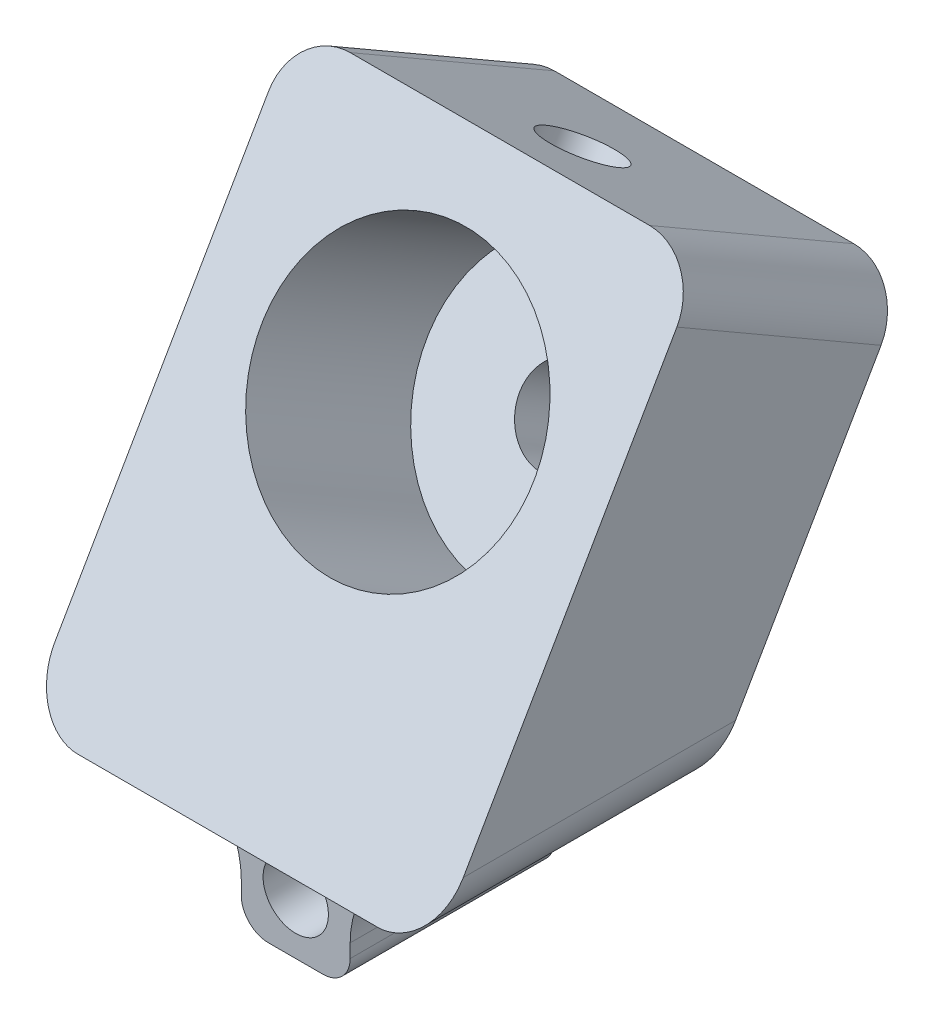
ISO-10303-21;
HEADER;
FILE_DESCRIPTION(('STEP AP214'),'2;1');
FILE_NAME('part.step','',(''),(''),'','','');
FILE_SCHEMA(('AUTOMOTIVE_DESIGN { 1 0 10303 214 1 1 1 1 }'));
ENDSEC;
DATA;
#1=APPLICATION_CONTEXT('core data for automotive mechanical design processes');
#2=APPLICATION_PROTOCOL_DEFINITION('international standard','automotive_design',2000,#1);
#3=PRODUCT_CONTEXT('',#1,'mechanical');
#4=PRODUCT('Part','Part','',(#3));
#5=PRODUCT_RELATED_PRODUCT_CATEGORY('part','',(#4));
#6=PRODUCT_DEFINITION_FORMATION('','',#4);
#7=PRODUCT_DEFINITION_CONTEXT('part definition',#1,'design');
#8=PRODUCT_DEFINITION('design','',#6,#7);
#9=PRODUCT_DEFINITION_SHAPE('','',#8);
#10=(LENGTH_UNIT() NAMED_UNIT(*) SI_UNIT(.MILLI.,.METRE.));
#11=(NAMED_UNIT(*) PLANE_ANGLE_UNIT() SI_UNIT($,.RADIAN.));
#12=(NAMED_UNIT(*) SI_UNIT($,.STERADIAN.) SOLID_ANGLE_UNIT());
#13=UNCERTAINTY_MEASURE_WITH_UNIT(LENGTH_MEASURE(1.E-05),#10,'distance_accuracy_value','');
#14=(GEOMETRIC_REPRESENTATION_CONTEXT(3) GLOBAL_UNCERTAINTY_ASSIGNED_CONTEXT((#13)) GLOBAL_UNIT_ASSIGNED_CONTEXT((#10,
#11,#12)) REPRESENTATION_CONTEXT('',''));
#15=CARTESIAN_POINT('',(0.,0.,0.));
#16=DIRECTION('',(0.,0.,1.));
#17=DIRECTION('',(1.,0.,0.));
#18=AXIS2_PLACEMENT_3D('',#15,#16,#17);
#19=CARTESIAN_POINT('',(2.,-2.5,3.75));
#20=DIRECTION('',(-1.,0.,0.));
#21=DIRECTION('',(0.,0.,1.));
#22=AXIS2_PLACEMENT_3D('',#19,#20,#21);
#23=PLANE('',#22);
#24=DIRECTION('',(0.,1.,0.));
#25=VECTOR('',#24,1.);
#26=CARTESIAN_POINT('',(2.,-2.5,3.75));
#27=LINE('',#26,#25);
#28=CARTESIAN_POINT('',(2.,-1.5,3.75));
#29=VERTEX_POINT('',#28);
#30=CARTESIAN_POINT('',(2.,-1.,3.75));
#31=VERTEX_POINT('',#30);
#32=EDGE_CURVE('E239',#29,#31,#27,.T.);
#33=ORIENTED_EDGE('',*,*,#32,.F.);
#34=DIRECTION('',(0.,0.,-1.));
#35=VECTOR('',#34,1.);
#36=CARTESIAN_POINT('',(2.,-1.5,3.75));
#37=LINE('',#36,#35);
#38=CARTESIAN_POINT('',(2.,-1.5,-3.75));
#39=VERTEX_POINT('',#38);
#40=EDGE_CURVE('E349',#29,#39,#37,.T.);
#41=ORIENTED_EDGE('',*,*,#40,.T.);
#42=DIRECTION('',(0.,1.,0.));
#43=VECTOR('',#42,1.);
#44=CARTESIAN_POINT('',(2.,-2.5,-3.75));
#45=LINE('',#44,#43);
#46=CARTESIAN_POINT('',(2.,-1.,-3.75));
#47=VERTEX_POINT('',#46);
#48=EDGE_CURVE('E233',#39,#47,#45,.T.);
#49=ORIENTED_EDGE('',*,*,#48,.T.);
#50=DIRECTION('',(0.,0.,-1.));
#51=VECTOR('',#50,1.);
#52=CARTESIAN_POINT('',(2.,-1.,3.75));
#53=LINE('',#52,#51);
#54=EDGE_CURVE('E275',#47,#31,#53,.F.);
#55=ORIENTED_EDGE('',*,*,#54,.T.);
#56=EDGE_LOOP('',(#33,#41,#49,#55));
#57=FACE_BOUND('',#56,.T.);
#58=ADVANCED_FACE('F39',(#57),#23,.F.);
#59=CARTESIAN_POINT('',(-2.,-2.5,3.75));
#60=DIRECTION('',(1.,0.,0.));
#61=DIRECTION('',(0.,0.,-1.));
#62=AXIS2_PLACEMENT_3D('',#59,#60,#61);
#63=PLANE('',#62);
#64=DIRECTION('',(0.,-1.,0.));
#65=VECTOR('',#64,1.);
#66=CARTESIAN_POINT('',(-2.,-2.5,-3.75));
#67=LINE('',#66,#65);
#68=CARTESIAN_POINT('',(-2.,-1.,-3.75));
#69=VERTEX_POINT('',#68);
#70=CARTESIAN_POINT('',(-2.,-1.5,-3.75));
#71=VERTEX_POINT('',#70);
#72=EDGE_CURVE('E256',#69,#71,#67,.T.);
#73=ORIENTED_EDGE('',*,*,#72,.T.);
#74=DIRECTION('',(0.,0.,-1.));
#75=VECTOR('',#74,1.);
#76=CARTESIAN_POINT('',(-2.,-1.5,3.75));
#77=LINE('',#76,#75);
#78=CARTESIAN_POINT('',(-2.,-1.5,3.75));
#79=VERTEX_POINT('',#78);
#80=EDGE_CURVE('E372',#71,#79,#77,.F.);
#81=ORIENTED_EDGE('',*,*,#80,.T.);
#82=DIRECTION('',(0.,-1.,0.));
#83=VECTOR('',#82,1.);
#84=CARTESIAN_POINT('',(-2.,-2.5,3.75));
#85=LINE('',#84,#83);
#86=CARTESIAN_POINT('',(-2.,-1.,3.75));
#87=VERTEX_POINT('',#86);
#88=EDGE_CURVE('E242',#87,#79,#85,.T.);
#89=ORIENTED_EDGE('',*,*,#88,.F.);
#90=DIRECTION('',(0.,0.,-1.));
#91=VECTOR('',#90,1.);
#92=CARTESIAN_POINT('',(-2.,-1.,-3.75));
#93=LINE('',#92,#91);
#94=EDGE_CURVE('E279',#87,#69,#93,.T.);
#95=ORIENTED_EDGE('',*,*,#94,.T.);
#96=EDGE_LOOP('',(#73,#81,#89,#95));
#97=FACE_BOUND('',#96,.T.);
#98=ADVANCED_FACE('F438',(#97),#63,.F.);
#99=CARTESIAN_POINT('',(-2.,-2.5,3.75));
#100=DIRECTION('',(0.,1.,0.));
#101=DIRECTION('',(0.,0.,1.));
#102=AXIS2_PLACEMENT_3D('',#99,#100,#101);
#103=PLANE('',#102);
#104=DIRECTION('',(1.,0.,0.));
#105=VECTOR('',#104,1.);
#106=CARTESIAN_POINT('',(-2.,-2.5,-3.75));
#107=LINE('',#106,#105);
#108=CARTESIAN_POINT('',(-1.,-2.5,-3.75));
#109=VERTEX_POINT('',#108);
#110=CARTESIAN_POINT('',(1.,-2.5,-3.75));
#111=VERTEX_POINT('',#110);
#112=EDGE_CURVE('E243',#109,#111,#107,.T.);
#113=ORIENTED_EDGE('',*,*,#112,.T.);
#114=DIRECTION('',(0.,0.,-1.));
#115=VECTOR('',#114,1.);
#116=CARTESIAN_POINT('',(1.,-2.5,3.75));
#117=LINE('',#116,#115);
#118=CARTESIAN_POINT('',(1.,-2.5,3.75));
#119=VERTEX_POINT('',#118);
#120=EDGE_CURVE('E363',#111,#119,#117,.F.);
#121=ORIENTED_EDGE('',*,*,#120,.T.);
#122=DIRECTION('',(1.,0.,0.));
#123=VECTOR('',#122,1.);
#124=CARTESIAN_POINT('',(-2.,-2.5,3.75));
#125=LINE('',#124,#123);
#126=CARTESIAN_POINT('',(-1.,-2.5,3.75));
#127=VERTEX_POINT('',#126);
#128=EDGE_CURVE('E247',#127,#119,#125,.T.);
#129=ORIENTED_EDGE('',*,*,#128,.F.);
#130=DIRECTION('',(0.,0.,-1.));
#131=VECTOR('',#130,1.);
#132=CARTESIAN_POINT('',(-1.,-2.5,3.75));
#133=LINE('',#132,#131);
#134=EDGE_CURVE('E359',#127,#109,#133,.T.);
#135=ORIENTED_EDGE('',*,*,#134,.T.);
#136=EDGE_LOOP('',(#113,#121,#129,#135));
#137=FACE_BOUND('',#136,.T.);
#138=ADVANCED_FACE('F443',(#137),#103,.F.);
#139=CARTESIAN_POINT('',(0.,0.,3.75));
#140=DIRECTION('',(0.,0.,-1.));
#141=DIRECTION('',(-1.,0.,0.));
#142=AXIS2_PLACEMENT_3D('',#139,#140,#141);
#143=PLANE('',#142);
#144=CARTESIAN_POINT('',(0.,-0.5,3.75));
#145=DIRECTION('',(0.,0.,1.));
#146=DIRECTION('',(1.,0.,0.));
#147=AXIS2_PLACEMENT_3D('',#144,#145,#146);
#148=CIRCLE('',#147,1.2);
#149=CARTESIAN_POINT('',(1.2,-0.5,3.75));
#150=VERTEX_POINT('',#149);
#151=EDGE_CURVE('E268',#150,#150,#148,.T.);
#152=ORIENTED_EDGE('',*,*,#151,.F.);
#153=EDGE_LOOP('',(#152));
#154=FACE_BOUND('',#153,.T.);
#155=CARTESIAN_POINT('',(5.5,-1.,3.75));
#156=DIRECTION('',(0.,0.,-1.));
#157=DIRECTION('',(-1.,0.,0.));
#158=AXIS2_PLACEMENT_3D('',#155,#156,#157);
#159=CIRCLE('',#158,3.5);
#160=CARTESIAN_POINT('',(3.05051025721682,1.5,3.75));
#161=VERTEX_POINT('',#160);
#162=EDGE_CURVE('E287',#31,#161,#159,.T.);
#163=ORIENTED_EDGE('',*,*,#162,.T.);
#164=DIRECTION('',(-1.,0.,0.));
#165=VECTOR('',#164,1.);
#166=CARTESIAN_POINT('',(-5.5,1.5,3.75));
#167=LINE('',#166,#165);
#168=CARTESIAN_POINT('',(-3.05051025721682,1.5,3.75));
#169=VERTEX_POINT('',#168);
#170=EDGE_CURVE('E375',#161,#169,#167,.T.);
#171=ORIENTED_EDGE('',*,*,#170,.T.);
#172=CARTESIAN_POINT('',(-5.5,-1.,3.75));
#173=DIRECTION('',(0.,0.,-1.));
#174=DIRECTION('',(-1.,0.,0.));
#175=AXIS2_PLACEMENT_3D('',#172,#173,#174);
#176=CIRCLE('',#175,3.5);
#177=EDGE_CURVE('E295',#169,#87,#176,.T.);
#178=ORIENTED_EDGE('',*,*,#177,.T.);
#179=ORIENTED_EDGE('',*,*,#88,.T.);
#180=CARTESIAN_POINT('',(-1.,-1.5,3.75));
#181=DIRECTION('',(0.,0.,-1.));
#182=DIRECTION('',(-1.,0.,0.));
#183=AXIS2_PLACEMENT_3D('',#180,#181,#182);
#184=CIRCLE('',#183,1.);
#185=EDGE_CURVE('E366',#79,#127,#184,.F.);
#186=ORIENTED_EDGE('',*,*,#185,.T.);
#187=ORIENTED_EDGE('',*,*,#128,.T.);
#188=CARTESIAN_POINT('',(1.,-1.5,3.75));
#189=DIRECTION('',(0.,0.,-1.));
#190=DIRECTION('',(-1.,0.,0.));
#191=AXIS2_PLACEMENT_3D('',#188,#189,#190);
#192=CIRCLE('',#191,1.);
#193=EDGE_CURVE('E369',#119,#29,#192,.F.);
#194=ORIENTED_EDGE('',*,*,#193,.T.);
#195=ORIENTED_EDGE('',*,*,#32,.T.);
#196=EDGE_LOOP('',(#163,#171,#178,#179,#186,#187,#194,#195));
#197=FACE_BOUND('',#196,.T.);
#198=ADVANCED_FACE('F450',(#154,#197),#143,.F.);
#199=CARTESIAN_POINT('',(0.,0.,-3.75));
#200=DIRECTION('',(0.,0.,-1.));
#201=DIRECTION('',(-1.,0.,0.));
#202=AXIS2_PLACEMENT_3D('',#199,#200,#201);
#203=PLANE('',#202);
#204=DIRECTION('',(0.,1.,0.));
#205=VECTOR('',#204,1.);
#206=CARTESIAN_POINT('',(-1.55,-2.1,-3.75));
#207=LINE('',#206,#205);
#208=CARTESIAN_POINT('',(-1.55,-2.1,-3.75));
#209=VERTEX_POINT('',#208);
#210=CARTESIAN_POINT('',(-1.55,1.,-3.75));
#211=VERTEX_POINT('',#210);
#212=EDGE_CURVE('E188',#209,#211,#207,.T.);
#213=ORIENTED_EDGE('',*,*,#212,.F.);
#214=DIRECTION('',(-1.,0.,0.));
#215=VECTOR('',#214,1.);
#216=CARTESIAN_POINT('',(1.55,-2.1,-3.75));
#217=LINE('',#216,#215);
#218=CARTESIAN_POINT('',(1.55,-2.1,-3.75));
#219=VERTEX_POINT('',#218);
#220=EDGE_CURVE('E208',#219,#209,#217,.T.);
#221=ORIENTED_EDGE('',*,*,#220,.F.);
#222=DIRECTION('',(0.,-1.,0.));
#223=VECTOR('',#222,1.);
#224=CARTESIAN_POINT('',(1.55,-2.1,-3.75));
#225=LINE('',#224,#223);
#226=CARTESIAN_POINT('',(1.55,1.,-3.75));
#227=VERTEX_POINT('',#226);
#228=EDGE_CURVE('E212',#227,#219,#225,.T.);
#229=ORIENTED_EDGE('',*,*,#228,.F.);
#230=DIRECTION('',(1.,0.,0.));
#231=VECTOR('',#230,1.);
#232=CARTESIAN_POINT('',(1.55,1.,-3.75));
#233=LINE('',#232,#231);
#234=EDGE_CURVE('E224',#211,#227,#233,.T.);
#235=ORIENTED_EDGE('',*,*,#234,.F.);
#236=EDGE_LOOP('',(#213,#221,#229,#235));
#237=FACE_BOUND('',#236,.T.);
#238=ORIENTED_EDGE('',*,*,#48,.F.);
#239=CARTESIAN_POINT('',(1.,-1.5,-3.75));
#240=DIRECTION('',(0.,0.,-1.));
#241=DIRECTION('',(-1.,0.,0.));
#242=AXIS2_PLACEMENT_3D('',#239,#240,#241);
#243=CIRCLE('',#242,1.);
#244=EDGE_CURVE('E356',#39,#111,#243,.T.);
#245=ORIENTED_EDGE('',*,*,#244,.T.);
#246=ORIENTED_EDGE('',*,*,#112,.F.);
#247=CARTESIAN_POINT('',(-1.,-1.5,-3.75));
#248=DIRECTION('',(0.,0.,-1.));
#249=DIRECTION('',(-1.,0.,0.));
#250=AXIS2_PLACEMENT_3D('',#247,#248,#249);
#251=CIRCLE('',#250,1.);
#252=EDGE_CURVE('E353',#109,#71,#251,.T.);
#253=ORIENTED_EDGE('',*,*,#252,.T.);
#254=ORIENTED_EDGE('',*,*,#72,.F.);
#255=CARTESIAN_POINT('',(-5.5,-1.,-3.75));
#256=DIRECTION('',(0.,0.,-1.));
#257=DIRECTION('',(-1.,0.,0.));
#258=AXIS2_PLACEMENT_3D('',#255,#256,#257);
#259=CIRCLE('',#258,3.5);
#260=CARTESIAN_POINT('',(-5.5,2.5,-3.75));
#261=VERTEX_POINT('',#260);
#262=EDGE_CURVE('E291',#69,#261,#259,.F.);
#263=ORIENTED_EDGE('',*,*,#262,.T.);
#264=DIRECTION('',(-1.,0.,0.));
#265=VECTOR('',#264,1.);
#266=CARTESIAN_POINT('',(-2.,2.5,-3.75));
#267=LINE('',#266,#265);
#268=CARTESIAN_POINT('',(5.5,2.5,-3.75));
#269=VERTEX_POINT('',#268);
#270=EDGE_CURVE('E253',#269,#261,#267,.T.);
#271=ORIENTED_EDGE('',*,*,#270,.F.);
#272=CARTESIAN_POINT('',(5.5,-1.,-3.75));
#273=DIRECTION('',(0.,0.,-1.));
#274=DIRECTION('',(-1.,0.,0.));
#275=AXIS2_PLACEMENT_3D('',#272,#273,#274);
#276=CIRCLE('',#275,3.5);
#277=EDGE_CURVE('E283',#269,#47,#276,.F.);
#278=ORIENTED_EDGE('',*,*,#277,.T.);
#279=EDGE_LOOP('',(#238,#245,#246,#253,#254,#263,#271,#278));
#280=FACE_BOUND('',#279,.T.);
#281=ADVANCED_FACE('F452',(#237,#280),#203,.T.);
#282=CARTESIAN_POINT('',(-1.55,-2.1,1.25));
#283=DIRECTION('',(-1.,0.,0.));
#284=DIRECTION('',(0.,0.,1.));
#285=AXIS2_PLACEMENT_3D('',#282,#283,#284);
#286=PLANE('',#285);
#287=ORIENTED_EDGE('',*,*,#212,.T.);
#288=DIRECTION('',(0.,0.,-1.));
#289=VECTOR('',#288,1.);
#290=CARTESIAN_POINT('',(-1.55,1.,1.25));
#291=LINE('',#290,#289);
#292=CARTESIAN_POINT('',(-1.55,1.,1.25));
#293=VERTEX_POINT('',#292);
#294=EDGE_CURVE('E181',#293,#211,#291,.T.);
#295=ORIENTED_EDGE('',*,*,#294,.F.);
#296=DIRECTION('',(0.,1.,0.));
#297=VECTOR('',#296,1.);
#298=CARTESIAN_POINT('',(-1.55,-2.1,1.25));
#299=LINE('',#298,#297);
#300=CARTESIAN_POINT('',(-1.55,-2.1,1.25));
#301=VERTEX_POINT('',#300);
#302=EDGE_CURVE('E185',#301,#293,#299,.T.);
#303=ORIENTED_EDGE('',*,*,#302,.F.);
#304=DIRECTION('',(0.,0.,-1.));
#305=VECTOR('',#304,1.);
#306=CARTESIAN_POINT('',(-1.55,-2.1,1.25));
#307=LINE('',#306,#305);
#308=EDGE_CURVE('E230',#301,#209,#307,.T.);
#309=ORIENTED_EDGE('',*,*,#308,.T.);
#310=EDGE_LOOP('',(#287,#295,#303,#309));
#311=FACE_BOUND('',#310,.T.);
#312=ADVANCED_FACE('F183',(#311),#286,.F.);
#313=CARTESIAN_POINT('',(1.55,-2.1,1.25));
#314=DIRECTION('',(0.,-1.,0.));
#315=DIRECTION('',(0.,0.,-1.));
#316=AXIS2_PLACEMENT_3D('',#313,#314,#315);
#317=PLANE('',#316);
#318=ORIENTED_EDGE('',*,*,#220,.T.);
#319=ORIENTED_EDGE('',*,*,#308,.F.);
#320=DIRECTION('',(-1.,0.,0.));
#321=VECTOR('',#320,1.);
#322=CARTESIAN_POINT('',(1.55,-2.1,1.25));
#323=LINE('',#322,#321);
#324=CARTESIAN_POINT('',(1.55,-2.1,1.25));
#325=VERTEX_POINT('',#324);
#326=EDGE_CURVE('E194',#325,#301,#323,.T.);
#327=ORIENTED_EDGE('',*,*,#326,.F.);
#328=DIRECTION('',(0.,0.,-1.));
#329=VECTOR('',#328,1.);
#330=CARTESIAN_POINT('',(1.55,-2.1,1.25));
#331=LINE('',#330,#329);
#332=EDGE_CURVE('E234',#325,#219,#331,.T.);
#333=ORIENTED_EDGE('',*,*,#332,.T.);
#334=EDGE_LOOP('',(#318,#319,#327,#333));
#335=FACE_BOUND('',#334,.T.);
#336=ADVANCED_FACE('F461',(#335),#317,.F.);
#337=CARTESIAN_POINT('',(1.55,-2.1,1.25));
#338=DIRECTION('',(1.,0.,0.));
#339=DIRECTION('',(0.,0.,-1.));
#340=AXIS2_PLACEMENT_3D('',#337,#338,#339);
#341=PLANE('',#340);
#342=ORIENTED_EDGE('',*,*,#228,.T.);
#343=ORIENTED_EDGE('',*,*,#332,.F.);
#344=DIRECTION('',(0.,-1.,0.));
#345=VECTOR('',#344,1.);
#346=CARTESIAN_POINT('',(1.55,-2.1,1.25));
#347=LINE('',#346,#345);
#348=CARTESIAN_POINT('',(1.55,1.,1.25));
#349=VERTEX_POINT('',#348);
#350=EDGE_CURVE('E203',#349,#325,#347,.T.);
#351=ORIENTED_EDGE('',*,*,#350,.F.);
#352=DIRECTION('',(0.,0.,-1.));
#353=VECTOR('',#352,1.);
#354=CARTESIAN_POINT('',(1.55,1.,1.25));
#355=LINE('',#354,#353);
#356=EDGE_CURVE('E193',#349,#227,#355,.T.);
#357=ORIENTED_EDGE('',*,*,#356,.T.);
#358=EDGE_LOOP('',(#342,#343,#351,#357));
#359=FACE_BOUND('',#358,.T.);
#360=ADVANCED_FACE('F464',(#359),#341,.F.);
#361=CARTESIAN_POINT('',(1.55,1.,1.25));
#362=DIRECTION('',(0.,1.,0.));
#363=DIRECTION('',(0.,0.,1.));
#364=AXIS2_PLACEMENT_3D('',#361,#362,#363);
#365=PLANE('',#364);
#366=ORIENTED_EDGE('',*,*,#234,.T.);
#367=ORIENTED_EDGE('',*,*,#356,.F.);
#368=DIRECTION('',(1.,0.,0.));
#369=VECTOR('',#368,1.);
#370=CARTESIAN_POINT('',(1.55,1.,1.25));
#371=LINE('',#370,#369);
#372=EDGE_CURVE('E197',#293,#349,#371,.T.);
#373=ORIENTED_EDGE('',*,*,#372,.F.);
#374=ORIENTED_EDGE('',*,*,#294,.T.);
#375=EDGE_LOOP('',(#366,#367,#373,#374));
#376=FACE_BOUND('',#375,.T.);
#377=ADVANCED_FACE('F198',(#376),#365,.F.);
#378=CARTESIAN_POINT('',(0.,0.,1.25));
#379=DIRECTION('',(0.,0.,1.));
#380=DIRECTION('',(1.,0.,0.));
#381=AXIS2_PLACEMENT_3D('',#378,#379,#380);
#382=PLANE('',#381);
#383=CARTESIAN_POINT('',(0.,-0.5,1.25));
#384=DIRECTION('',(0.,0.,1.));
#385=DIRECTION('',(1.,0.,0.));
#386=AXIS2_PLACEMENT_3D('',#383,#384,#385);
#387=CIRCLE('',#386,1.2);
#388=CARTESIAN_POINT('',(1.2,-0.5,1.25));
#389=VERTEX_POINT('',#388);
#390=EDGE_CURVE('E263',#389,#389,#387,.T.);
#391=ORIENTED_EDGE('',*,*,#390,.T.);
#392=EDGE_LOOP('',(#391));
#393=FACE_BOUND('',#392,.T.);
#394=ORIENTED_EDGE('',*,*,#302,.T.);
#395=ORIENTED_EDGE('',*,*,#372,.T.);
#396=ORIENTED_EDGE('',*,*,#350,.T.);
#397=ORIENTED_EDGE('',*,*,#326,.T.);
#398=EDGE_LOOP('',(#394,#395,#396,#397));
#399=FACE_BOUND('',#398,.T.);
#400=ADVANCED_FACE('F205',(#393,#399),#382,.F.);
#401=CARTESIAN_POINT('',(7.5,2.5,-3.75));
#402=DIRECTION('',(0.,1.,0.));
#403=DIRECTION('',(0.,0.,1.));
#404=AXIS2_PLACEMENT_3D('',#401,#402,#403);
#405=PLANE('',#404);
#406=DIRECTION('',(0.,0.,-1.));
#407=VECTOR('',#406,1.);
#408=CARTESIAN_POINT('',(-5.5,2.5,-3.75));
#409=LINE('',#408,#407);
#410=CARTESIAN_POINT('',(-5.5,2.5,6.25));
#411=VERTEX_POINT('',#410);
#412=CARTESIAN_POINT('',(-5.5,2.5,4.75));
#413=VERTEX_POINT('',#412);
#414=EDGE_CURVE('E343',#411,#413,#409,.T.);
#415=ORIENTED_EDGE('',*,*,#414,.T.);
#416=DIRECTION('',(-1.,0.,0.));
#417=VECTOR('',#416,1.);
#418=CARTESIAN_POINT('',(5.5,2.5,4.75));
#419=LINE('',#418,#417);
#420=CARTESIAN_POINT('',(5.5,2.5,4.75));
#421=VERTEX_POINT('',#420);
#422=EDGE_CURVE('E385',#413,#421,#419,.F.);
#423=ORIENTED_EDGE('',*,*,#422,.T.);
#424=DIRECTION('',(0.,0.,-1.));
#425=VECTOR('',#424,1.);
#426=CARTESIAN_POINT('',(5.5,2.5,-3.75));
#427=LINE('',#426,#425);
#428=CARTESIAN_POINT('',(5.5,2.5,6.25));
#429=VERTEX_POINT('',#428);
#430=EDGE_CURVE('E346',#421,#429,#427,.F.);
#431=ORIENTED_EDGE('',*,*,#430,.T.);
#432=DIRECTION('',(-1.,0.,0.));
#433=VECTOR('',#432,1.);
#434=CARTESIAN_POINT('',(7.5,2.5,6.25));
#435=LINE('',#434,#433);
#436=EDGE_CURVE('E549',#429,#411,#435,.T.);
#437=ORIENTED_EDGE('',*,*,#436,.T.);
#438=EDGE_LOOP('',(#415,#423,#431,#437));
#439=FACE_BOUND('',#438,.T.);
#440=ADVANCED_FACE('F473',(#439),#405,.F.);
#441=CARTESIAN_POINT('',(7.5,15.4903810567665,-11.2500000000001));
#442=DIRECTION('',(0.,0.500000000000004,0.866025403784436));
#443=DIRECTION('',(0.,-0.866025403784436,0.500000000000004));
#444=AXIS2_PLACEMENT_3D('',#441,#442,#443);
#445=PLANE('',#444);
#446=CARTESIAN_POINT('',(0.,8.99519052838327,-7.50000000000003));
#447=DIRECTION('',(0.,-0.500000000000004,-0.866025403784437));
#448=DIRECTION('',(0.,0.866025403784437,-0.500000000000004));
#449=AXIS2_PLACEMENT_3D('',#446,#447,#448);
#450=CIRCLE('',#449,1.5875);
#451=CARTESIAN_POINT('',(0.,10.3700058568911,-8.29375000000003));
#452=VERTEX_POINT('',#451);
#453=EDGE_CURVE('E381',#452,#452,#450,.T.);
#454=ORIENTED_EDGE('',*,*,#453,.F.);
#455=EDGE_LOOP('',(#454));
#456=FACE_BOUND('',#455,.T.);
#457=DIRECTION('',(0.,0.866025403784436,-0.500000000000004));
#458=VECTOR('',#457,1.);
#459=CARTESIAN_POINT('',(-7.5,15.4903810567665,-11.2500000000001));
#460=LINE('',#459,#458);
#461=CARTESIAN_POINT('',(-7.5,4.5,-4.90470053837926));
#462=VERTEX_POINT('',#461);
#463=CARTESIAN_POINT('',(-7.5,13.7583302491977,-10.2500000000001));
#464=VERTEX_POINT('',#463);
#465=EDGE_CURVE('E267',#462,#464,#460,.T.);
#466=ORIENTED_EDGE('',*,*,#465,.T.);
#467=CARTESIAN_POINT('',(-5.5,13.7583302491977,-10.2500000000001));
#468=DIRECTION('',(0.,0.500000000000004,0.866025403784436));
#469=DIRECTION('',(0.,-0.866025403784436,0.500000000000004));
#470=AXIS2_PLACEMENT_3D('',#467,#468,#469);
#471=CIRCLE('',#470,2.);
#472=CARTESIAN_POINT('',(-5.5,15.4903810567665,-11.2500000000001));
#473=VERTEX_POINT('',#472);
#474=EDGE_CURVE('E332',#464,#473,#471,.F.);
#475=ORIENTED_EDGE('',*,*,#474,.T.);
#476=DIRECTION('',(-1.,0.,0.));
#477=VECTOR('',#476,1.);
#478=CARTESIAN_POINT('',(7.5,15.4903810567665,-11.2500000000001));
#479=LINE('',#478,#477);
#480=CARTESIAN_POINT('',(5.5,15.4903810567665,-11.2500000000001));
#481=VERTEX_POINT('',#480);
#482=EDGE_CURVE('E215',#481,#473,#479,.T.);
#483=ORIENTED_EDGE('',*,*,#482,.F.);
#484=CARTESIAN_POINT('',(5.5,13.7583302491977,-10.2500000000001));
#485=DIRECTION('',(0.,0.500000000000004,0.866025403784436));
#486=DIRECTION('',(0.,-0.866025403784436,0.500000000000004));
#487=AXIS2_PLACEMENT_3D('',#484,#485,#486);
#488=CIRCLE('',#487,2.);
#489=CARTESIAN_POINT('',(7.5,13.7583302491977,-10.2500000000001));
#490=VERTEX_POINT('',#489);
#491=EDGE_CURVE('E329',#481,#490,#488,.F.);
#492=ORIENTED_EDGE('',*,*,#491,.T.);
#493=DIRECTION('',(0.,0.866025403784436,-0.500000000000004));
#494=VECTOR('',#493,1.);
#495=CARTESIAN_POINT('',(7.5,15.4903810567665,-11.2500000000001));
#496=LINE('',#495,#494);
#497=CARTESIAN_POINT('',(7.5,4.5,-4.90470053837926));
#498=VERTEX_POINT('',#497);
#499=EDGE_CURVE('E540',#498,#490,#496,.T.);
#500=ORIENTED_EDGE('',*,*,#499,.F.);
#501=CARTESIAN_POINT('',(5.5,4.5,-4.90470053837926));
#502=DIRECTION('',(0.,0.500000000000004,0.866025403784436));
#503=DIRECTION('',(0.,0.866025403784436,-0.500000000000004));
#504=AXIS2_PLACEMENT_3D('',#501,#502,#503);
#505=ELLIPSE('',#504,2.30940107675851,2.);
#506=EDGE_CURVE('E326',#498,#269,#505,.F.);
#507=ORIENTED_EDGE('',*,*,#506,.T.);
#508=ORIENTED_EDGE('',*,*,#270,.T.);
#509=CARTESIAN_POINT('',(-5.5,4.5,-4.90470053837926));
#510=DIRECTION('',(0.,0.500000000000004,0.866025403784436));
#511=DIRECTION('',(0.,-0.866025403784436,0.500000000000004));
#512=AXIS2_PLACEMENT_3D('',#509,#510,#511);
#513=ELLIPSE('',#512,2.30940107675851,2.);
#514=EDGE_CURVE('E323',#261,#462,#513,.F.);
#515=ORIENTED_EDGE('',*,*,#514,.T.);
#516=EDGE_LOOP('',(#466,#475,#483,#492,#500,#507,#508,#515));
#517=FACE_BOUND('',#516,.T.);
#518=ADVANCED_FACE('F477',(#456,#517),#445,.F.);
#519=CARTESIAN_POINT('',(7.5,19.8205080756888,-3.7500000000001));
#520=DIRECTION('',(0.,-0.866025403784436,0.500000000000004));
#521=DIRECTION('',(0.,-0.500000000000004,-0.866025403784437));
#522=AXIS2_PLACEMENT_3D('',#519,#520,#521);
#523=PLANE('',#522);
#524=CARTESIAN_POINT('',(0.,18.0705080756887,-6.78108891324562));
#525=DIRECTION('',(0.,0.866025403784437,-0.500000000000004));
#526=DIRECTION('',(0.,0.500000000000004,0.866025403784437));
#527=AXIS2_PLACEMENT_3D('',#524,#525,#526);
#528=CIRCLE('',#527,1.35);
#529=CARTESIAN_POINT('',(0.,18.7455080756888,-5.61195461813663));
#530=VERTEX_POINT('',#529);
#531=EDGE_CURVE('E520',#530,#530,#528,.T.);
#532=ORIENTED_EDGE('',*,*,#531,.F.);
#533=EDGE_LOOP('',(#532));
#534=FACE_BOUND('',#533,.T.);
#535=ORIENTED_EDGE('',*,*,#482,.T.);
#536=DIRECTION('',(0.,0.500000000000004,0.866025403784437));
#537=VECTOR('',#536,1.);
#538=CARTESIAN_POINT('',(-5.5,19.8205080756888,-3.7500000000001));
#539=LINE('',#538,#537);
#540=CARTESIAN_POINT('',(-5.5,19.8205080756888,-3.7500000000001));
#541=VERTEX_POINT('',#540);
#542=EDGE_CURVE('E301',#473,#541,#539,.T.);
#543=ORIENTED_EDGE('',*,*,#542,.T.);
#544=DIRECTION('',(-1.,0.,0.));
#545=VECTOR('',#544,1.);
#546=CARTESIAN_POINT('',(7.5,19.8205080756888,-3.7500000000001));
#547=LINE('',#546,#545);
#548=CARTESIAN_POINT('',(5.5,19.8205080756888,-3.7500000000001));
#549=VERTEX_POINT('',#548);
#550=EDGE_CURVE('E558',#549,#541,#547,.T.);
#551=ORIENTED_EDGE('',*,*,#550,.F.);
#552=DIRECTION('',(0.,0.500000000000004,0.866025403784437));
#553=VECTOR('',#552,1.);
#554=CARTESIAN_POINT('',(5.5,19.8205080756888,-3.7500000000001));
#555=LINE('',#554,#553);
#556=EDGE_CURVE('E298',#549,#481,#555,.F.);
#557=ORIENTED_EDGE('',*,*,#556,.T.);
#558=EDGE_LOOP('',(#535,#543,#551,#557));
#559=FACE_BOUND('',#558,.T.);
#560=ADVANCED_FACE('F481',(#534,#559),#523,.F.);
#561=CARTESIAN_POINT('',(7.5,2.5,6.25));
#562=DIRECTION('',(0.,-0.500000000000004,-0.866025403784436));
#563=DIRECTION('',(0.,0.866025403784436,-0.500000000000004));
#564=AXIS2_PLACEMENT_3D('',#561,#562,#563);
#565=PLANE('',#564);
#566=CARTESIAN_POINT('',(0.,13.3253175473055,0.));
#567=DIRECTION('',(0.,0.500000000000004,0.866025403784436));
#568=DIRECTION('',(0.,-0.866025403784436,0.500000000000004));
#569=AXIS2_PLACEMENT_3D('',#566,#567,#568);
#570=CIRCLE('',#569,5.);
#571=CARTESIAN_POINT('',(0.,8.99519052838331,2.49999999999995));
#572=VERTEX_POINT('',#571);
#573=EDGE_CURVE('E380',#572,#572,#570,.T.);
#574=ORIENTED_EDGE('',*,*,#573,.F.);
#575=EDGE_LOOP('',(#574));
#576=FACE_BOUND('',#575,.T.);
#577=ORIENTED_EDGE('',*,*,#550,.T.);
#578=CARTESIAN_POINT('',(-5.5,18.0884572681199,-2.75000000000009));
#579=DIRECTION('',(0.,-0.500000000000004,-0.866025403784436));
#580=DIRECTION('',(0.,0.866025403784436,-0.500000000000004));
#581=AXIS2_PLACEMENT_3D('',#578,#579,#580);
#582=CIRCLE('',#581,2.);
#583=CARTESIAN_POINT('',(-7.5,18.0884572681199,-2.75000000000008));
#584=VERTEX_POINT('',#583);
#585=EDGE_CURVE('E314',#541,#584,#582,.F.);
#586=ORIENTED_EDGE('',*,*,#585,.T.);
#587=DIRECTION('',(0.,-0.866025403784436,0.500000000000004));
#588=VECTOR('',#587,1.);
#589=CARTESIAN_POINT('',(-7.5,2.5,6.25));
#590=LINE('',#589,#588);
#591=CARTESIAN_POINT('',(-7.5,4.5,5.09529946162074));
#592=VERTEX_POINT('',#591);
#593=EDGE_CURVE('E545',#584,#592,#590,.T.);
#594=ORIENTED_EDGE('',*,*,#593,.T.);
#595=CARTESIAN_POINT('',(-5.5,4.5,5.09529946162074));
#596=DIRECTION('',(0.,-0.500000000000004,-0.866025403784436));
#597=DIRECTION('',(0.,-0.866025403784436,0.500000000000004));
#598=AXIS2_PLACEMENT_3D('',#595,#596,#597);
#599=ELLIPSE('',#598,2.30940107675851,2.);
#600=EDGE_CURVE('E305',#592,#411,#599,.F.);
#601=ORIENTED_EDGE('',*,*,#600,.T.);
#602=ORIENTED_EDGE('',*,*,#436,.F.);
#603=CARTESIAN_POINT('',(5.5,4.5,5.09529946162074));
#604=DIRECTION('',(0.,-0.500000000000004,-0.866025403784436));
#605=DIRECTION('',(0.,0.866025403784436,-0.500000000000004));
#606=AXIS2_PLACEMENT_3D('',#603,#604,#605);
#607=ELLIPSE('',#606,2.30940107675851,2.);
#608=CARTESIAN_POINT('',(7.5,4.5,5.09529946162074));
#609=VERTEX_POINT('',#608);
#610=EDGE_CURVE('E308',#429,#609,#607,.F.);
#611=ORIENTED_EDGE('',*,*,#610,.T.);
#612=DIRECTION('',(0.,-0.866025403784436,0.500000000000004));
#613=VECTOR('',#612,1.);
#614=CARTESIAN_POINT('',(7.5,2.5,6.25));
#615=LINE('',#614,#613);
#616=CARTESIAN_POINT('',(7.5,18.0884572681199,-2.75000000000008));
#617=VERTEX_POINT('',#616);
#618=EDGE_CURVE('E544',#617,#609,#615,.T.);
#619=ORIENTED_EDGE('',*,*,#618,.F.);
#620=CARTESIAN_POINT('',(5.5,18.0884572681199,-2.75000000000009));
#621=DIRECTION('',(0.,-0.500000000000004,-0.866025403784436));
#622=DIRECTION('',(0.,0.866025403784436,-0.500000000000004));
#623=AXIS2_PLACEMENT_3D('',#620,#621,#622);
#624=CIRCLE('',#623,2.);
#625=EDGE_CURVE('E311',#617,#549,#624,.F.);
#626=ORIENTED_EDGE('',*,*,#625,.T.);
#627=EDGE_LOOP('',(#577,#586,#594,#601,#602,#611,#619,#626));
#628=FACE_BOUND('',#627,.T.);
#629=ADVANCED_FACE('F485',(#576,#628),#565,.F.);
#630=CARTESIAN_POINT('',(7.5,0.,0.));
#631=DIRECTION('',(-1.,0.,0.));
#632=DIRECTION('',(0.,0.,1.));
#633=AXIS2_PLACEMENT_3D('',#630,#631,#632);
#634=PLANE('',#633);
#635=ORIENTED_EDGE('',*,*,#499,.T.);
#636=DIRECTION('',(0.,0.500000000000004,0.866025403784437));
#637=VECTOR('',#636,1.);
#638=CARTESIAN_POINT('',(7.5,14.7571278812935,-8.52003175473061));
#639=LINE('',#638,#637);
#640=EDGE_CURVE('E339',#490,#617,#639,.T.);
#641=ORIENTED_EDGE('',*,*,#640,.T.);
#642=ORIENTED_EDGE('',*,*,#618,.T.);
#643=DIRECTION('',(0.,0.,-1.));
#644=VECTOR('',#643,1.);
#645=CARTESIAN_POINT('',(7.5,4.5,0.));
#646=LINE('',#645,#644);
#647=EDGE_CURVE('E335',#609,#498,#646,.T.);
#648=ORIENTED_EDGE('',*,*,#647,.T.);
#649=EDGE_LOOP('',(#635,#641,#642,#648));
#650=FACE_BOUND('',#649,.T.);
#651=ADVANCED_FACE('F489',(#650),#634,.F.);
#652=CARTESIAN_POINT('',(-7.5,0.,0.));
#653=DIRECTION('',(-1.,0.,0.));
#654=DIRECTION('',(0.,0.,1.));
#655=AXIS2_PLACEMENT_3D('',#652,#653,#654);
#656=PLANE('',#655);
#657=ORIENTED_EDGE('',*,*,#593,.F.);
#658=DIRECTION('',(0.,0.500000000000004,0.866025403784437));
#659=VECTOR('',#658,1.);
#660=CARTESIAN_POINT('',(-7.5,13.7583302491977,-10.2500000000001));
#661=LINE('',#660,#659);
#662=EDGE_CURVE('E320',#584,#464,#661,.F.);
#663=ORIENTED_EDGE('',*,*,#662,.T.);
#664=ORIENTED_EDGE('',*,*,#465,.F.);
#665=DIRECTION('',(0.,0.,-1.));
#666=VECTOR('',#665,1.);
#667=CARTESIAN_POINT('',(-7.5,4.5,6.25));
#668=LINE('',#667,#666);
#669=EDGE_CURVE('E317',#462,#592,#668,.F.);
#670=ORIENTED_EDGE('',*,*,#669,.T.);
#671=EDGE_LOOP('',(#657,#663,#664,#670));
#672=FACE_BOUND('',#671,.T.);
#673=ADVANCED_FACE('F491',(#672),#656,.T.);
#674=CARTESIAN_POINT('',(0.,-0.5,3.75));
#675=DIRECTION('',(0.,0.,1.));
#676=DIRECTION('',(1.,0.,0.));
#677=AXIS2_PLACEMENT_3D('',#674,#675,#676);
#678=CYLINDRICAL_SURFACE('',#677,1.2);
#679=ORIENTED_EDGE('',*,*,#151,.T.);
#680=EDGE_LOOP('',(#679));
#681=FACE_BOUND('',#680,.T.);
#682=ORIENTED_EDGE('',*,*,#390,.F.);
#683=EDGE_LOOP('',(#682));
#684=FACE_BOUND('',#683,.T.);
#685=ADVANCED_FACE('F494',(#681,#684),#678,.F.);
#686=CARTESIAN_POINT('',(5.5,-1.,-3.75));
#687=DIRECTION('',(0.,0.,1.));
#688=DIRECTION('',(0.,-1.,0.));
#689=AXIS2_PLACEMENT_3D('',#686,#687,#688);
#690=CYLINDRICAL_SURFACE('',#689,3.5);
#691=ORIENTED_EDGE('',*,*,#162,.F.);
#692=ORIENTED_EDGE('',*,*,#54,.F.);
#693=ORIENTED_EDGE('',*,*,#277,.F.);
#694=DIRECTION('',(0.,0.,-1.));
#695=VECTOR('',#694,1.);
#696=CARTESIAN_POINT('',(5.5,2.5,-3.75));
#697=LINE('',#696,#695);
#698=EDGE_CURVE('E271',#421,#269,#697,.T.);
#699=ORIENTED_EDGE('',*,*,#698,.F.);
#700=CARTESIAN_POINT('',(3.05051025721682,1.5,3.75));
#701=CARTESIAN_POINT('',(3.09208505561,1.54074789419976,3.75001557612278));
#702=CARTESIAN_POINT('',(3.13464867321138,1.58040582871374,3.75248849197856));
#703=CARTESIAN_POINT('',(3.22135537764737,1.65727511860077,3.76168479111055));
#704=CARTESIAN_POINT('',(3.26549527791498,1.69449102136615,3.7684000115115));
#705=CARTESIAN_POINT('',(3.35472026437784,1.76604816909234,3.78534620625037));
#706=CARTESIAN_POINT('',(3.39979347226209,1.80041201205357,3.7955454218466));
#707=CARTESIAN_POINT('',(3.49105333078551,1.86658542973755,3.81895347386776));
#708=CARTESIAN_POINT('',(3.53724069110119,1.89839331738891,3.83216427639182));
#709=CARTESIAN_POINT('',(3.65426612254831,1.97495182237962,3.86851218728761));
#710=CARTESIAN_POINT('',(3.72568515579165,2.0180494852617,3.89327912021075));
#711=CARTESIAN_POINT('',(3.87005002251321,2.09840218451073,3.94734278290181));
#712=CARTESIAN_POINT('',(3.9429963200768,2.13565541486164,3.9766409073427));
#713=CARTESIAN_POINT('',(4.16436155114195,2.23924397885326,4.0701356502011));
#714=CARTESIAN_POINT('',(4.31460798399232,2.29695834555006,4.13969700610726));
#715=CARTESIAN_POINT('',(4.63492553954118,2.39601776888478,4.29543987582815));
#716=CARTESIAN_POINT('',(4.80529711270534,2.43473248184498,4.38261241710767));
#717=CARTESIAN_POINT('',(5.14703420756687,2.48642283189245,4.56136380994111));
#718=CARTESIAN_POINT('',(5.31839528398573,2.49947445066978,4.65292882933545));
#719=CARTESIAN_POINT('',(5.49304342141895,2.49999480818688,4.74628155527773));
#720=CARTESIAN_POINT('',(5.49652175415367,2.49999999279261,4.74814080246014));
#721=CARTESIAN_POINT('',(5.5,2.5,4.75));
#722=B_SPLINE_CURVE_WITH_KNOTS('',3,(#700,#701,#702,#703,#704,#705,#706,#707,#708,#709,#710,
#711,#712,#713,#714,#715,#716,#717,#718,#719,#720,#721),.UNSPECIFIED.,.F.,.F.,(4,2,2,2,2,2,2,2,
2,2,4),(0.,0.17449034064901,0.348645952234581,0.521254615366207,0.693976289542155,
0.954613158389459,1.21533040991093,1.73932617466127,2.32330896738522,2.90556012110161,
2.91739229089324),.UNSPECIFIED.);
#723=EDGE_CURVE('E11',#421,#161,#722,.F.);
#724=ORIENTED_EDGE('',*,*,#723,.T.);
#725=EDGE_LOOP('',(#691,#692,#693,#699,#724));
#726=FACE_BOUND('',#725,.T.);
#727=ADVANCED_FACE('F406',(#726),#690,.F.);
#728=CARTESIAN_POINT('',(-5.5,-1.,3.75));
#729=DIRECTION('',(0.,0.,1.));
#730=DIRECTION('',(0.,-1.,0.));
#731=AXIS2_PLACEMENT_3D('',#728,#729,#730);
#732=CYLINDRICAL_SURFACE('',#731,3.5);
#733=ORIENTED_EDGE('',*,*,#177,.F.);
#734=CARTESIAN_POINT('',(-3.05051025721682,1.5,3.75));
#735=CARTESIAN_POINT('',(-3.09208505561,1.54074789419976,3.75001557612278));
#736=CARTESIAN_POINT('',(-3.13464867321137,1.58040582871373,3.75248849197856));
#737=CARTESIAN_POINT('',(-3.22135537764735,1.65727511860076,3.76168479111055));
#738=CARTESIAN_POINT('',(-3.26549527791495,1.69449102136614,3.76840001151149));
#739=CARTESIAN_POINT('',(-3.35472026437781,1.76604816909232,3.78534620625036));
#740=CARTESIAN_POINT('',(-3.39979347226208,1.80041201205356,3.79554542184659));
#741=CARTESIAN_POINT('',(-3.4910533307855,1.86658542973755,3.81895347386776));
#742=CARTESIAN_POINT('',(-3.53724069110118,1.89839331738891,3.83216427639182));
#743=CARTESIAN_POINT('',(-3.65426612254831,1.97495182237962,3.86851218728761));
#744=CARTESIAN_POINT('',(-3.72568515579166,2.0180494852617,3.89327912021076));
#745=CARTESIAN_POINT('',(-3.87005002251323,2.09840218451073,3.94734278290182));
#746=CARTESIAN_POINT('',(-3.94299632007682,2.13565541486165,3.9766409073427));
#747=CARTESIAN_POINT('',(-4.16436155114195,2.23924397885327,4.07013565020111));
#748=CARTESIAN_POINT('',(-4.3146079839923,2.29695834555006,4.13969700610733));
#749=CARTESIAN_POINT('',(-4.63492553954122,2.39601776888478,4.29543987582809));
#750=CARTESIAN_POINT('',(-4.80529711270549,2.43473248184498,4.38261241710739));
#751=CARTESIAN_POINT('',(-5.14703420756672,2.48642283189245,4.56136380994139));
#752=CARTESIAN_POINT('',(-5.31839528398517,2.49947445066978,4.65292882933649));
#753=CARTESIAN_POINT('',(-5.49304342141893,2.49999480818688,4.74628155527777));
#754=CARTESIAN_POINT('',(-5.49652175415366,2.49999999279261,4.74814080246017));
#755=CARTESIAN_POINT('',(-5.5,2.5,4.75));
#756=B_SPLINE_CURVE_WITH_KNOTS('',3,(#734,#735,#736,#737,#738,#739,#740,#741,#742,#743,#744,
#745,#746,#747,#748,#749,#750,#751,#752,#753,#754,#755),.UNSPECIFIED.,.F.,.F.,(4,2,2,2,2,2,2,2,
2,2,4),(0.,0.174490340648993,0.348645952234546,0.52125461536619,0.693976289542156,
0.954613158389472,1.21533040991096,1.73932617466127,2.32330896738521,2.90556012110161,
2.91739229089324),.UNSPECIFIED.);
#757=EDGE_CURVE('E56',#169,#413,#756,.T.);
#758=ORIENTED_EDGE('',*,*,#757,.T.);
#759=DIRECTION('',(0.,0.,-1.));
#760=VECTOR('',#759,1.);
#761=CARTESIAN_POINT('',(-5.5,2.5,3.75));
#762=LINE('',#761,#760);
#763=EDGE_CURVE('E62',#261,#413,#762,.F.);
#764=ORIENTED_EDGE('',*,*,#763,.F.);
#765=ORIENTED_EDGE('',*,*,#262,.F.);
#766=ORIENTED_EDGE('',*,*,#94,.F.);
#767=EDGE_LOOP('',(#733,#758,#764,#765,#766));
#768=FACE_BOUND('',#767,.T.);
#769=ADVANCED_FACE('F401',(#768),#732,.F.);
#770=CARTESIAN_POINT('',(-5.5,18.0884572681199,-2.75000000000009));
#771=DIRECTION('',(0.,-0.500000000000004,-0.866025403784437));
#772=DIRECTION('',(0.,0.866025403784436,-0.500000000000004));
#773=AXIS2_PLACEMENT_3D('',#770,#771,#772);
#774=CYLINDRICAL_SURFACE('',#773,2.);
#775=ORIENTED_EDGE('',*,*,#474,.F.);
#776=ORIENTED_EDGE('',*,*,#662,.F.);
#777=ORIENTED_EDGE('',*,*,#585,.F.);
#778=ORIENTED_EDGE('',*,*,#542,.F.);
#779=EDGE_LOOP('',(#775,#776,#777,#778));
#780=FACE_BOUND('',#779,.T.);
#781=ADVANCED_FACE('F405',(#780),#774,.T.);
#782=CARTESIAN_POINT('',(5.5,14.7571278812935,-8.52003175473061));
#783=DIRECTION('',(0.,0.500000000000004,0.866025403784437));
#784=DIRECTION('',(0.,-0.866025403784436,0.500000000000004));
#785=AXIS2_PLACEMENT_3D('',#782,#783,#784);
#786=CYLINDRICAL_SURFACE('',#785,2.);
#787=ORIENTED_EDGE('',*,*,#491,.F.);
#788=ORIENTED_EDGE('',*,*,#556,.F.);
#789=ORIENTED_EDGE('',*,*,#625,.F.);
#790=ORIENTED_EDGE('',*,*,#640,.F.);
#791=EDGE_LOOP('',(#787,#788,#789,#790));
#792=FACE_BOUND('',#791,.T.);
#793=ADVANCED_FACE('F412',(#792),#786,.T.);
#794=CARTESIAN_POINT('',(5.5,4.5,0.));
#795=DIRECTION('',(0.,0.,-1.));
#796=DIRECTION('',(0.,1.,0.));
#797=AXIS2_PLACEMENT_3D('',#794,#795,#796);
#798=CYLINDRICAL_SURFACE('',#797,2.);
#799=ORIENTED_EDGE('',*,*,#430,.F.);
#800=ORIENTED_EDGE('',*,*,#698,.T.);
#801=ORIENTED_EDGE('',*,*,#506,.F.);
#802=ORIENTED_EDGE('',*,*,#647,.F.);
#803=ORIENTED_EDGE('',*,*,#610,.F.);
#804=EDGE_LOOP('',(#799,#800,#801,#802,#803));
#805=FACE_BOUND('',#804,.T.);
#806=ADVANCED_FACE('F416',(#805),#798,.T.);
#807=CARTESIAN_POINT('',(-5.5,4.5,-3.75));
#808=DIRECTION('',(0.,0.,1.));
#809=DIRECTION('',(0.,-1.,0.));
#810=AXIS2_PLACEMENT_3D('',#807,#808,#809);
#811=CYLINDRICAL_SURFACE('',#810,2.);
#812=ORIENTED_EDGE('',*,*,#600,.F.);
#813=ORIENTED_EDGE('',*,*,#669,.F.);
#814=ORIENTED_EDGE('',*,*,#514,.F.);
#815=ORIENTED_EDGE('',*,*,#763,.T.);
#816=ORIENTED_EDGE('',*,*,#414,.F.);
#817=EDGE_LOOP('',(#812,#813,#814,#815,#816));
#818=FACE_BOUND('',#817,.T.);
#819=ADVANCED_FACE('F420',(#818),#811,.T.);
#820=CARTESIAN_POINT('',(1.,-1.5,3.75));
#821=DIRECTION('',(0.,0.,-1.));
#822=DIRECTION('',(-1.,0.,0.));
#823=AXIS2_PLACEMENT_3D('',#820,#821,#822);
#824=CYLINDRICAL_SURFACE('',#823,1.);
#825=ORIENTED_EDGE('',*,*,#193,.F.);
#826=ORIENTED_EDGE('',*,*,#120,.F.);
#827=ORIENTED_EDGE('',*,*,#244,.F.);
#828=ORIENTED_EDGE('',*,*,#40,.F.);
#829=EDGE_LOOP('',(#825,#826,#827,#828));
#830=FACE_BOUND('',#829,.T.);
#831=ADVANCED_FACE('F424',(#830),#824,.T.);
#832=CARTESIAN_POINT('',(-1.,-1.5,3.75));
#833=DIRECTION('',(0.,0.,-1.));
#834=DIRECTION('',(-1.,0.,0.));
#835=AXIS2_PLACEMENT_3D('',#832,#833,#834);
#836=CYLINDRICAL_SURFACE('',#835,1.);
#837=ORIENTED_EDGE('',*,*,#185,.F.);
#838=ORIENTED_EDGE('',*,*,#80,.F.);
#839=ORIENTED_EDGE('',*,*,#252,.F.);
#840=ORIENTED_EDGE('',*,*,#134,.F.);
#841=EDGE_LOOP('',(#837,#838,#839,#840));
#842=FACE_BOUND('',#841,.T.);
#843=ADVANCED_FACE('F426',(#842),#836,.T.);
#844=CARTESIAN_POINT('',(0.,9.82531754730547,-6.06217782649112));
#845=DIRECTION('',(0.,0.500000000000004,0.866025403784436));
#846=DIRECTION('',(0.,-0.866025403784436,0.500000000000004));
#847=AXIS2_PLACEMENT_3D('',#844,#845,#846);
#848=CYLINDRICAL_SURFACE('',#847,5.);
#849=CARTESIAN_POINT('',(0.,16.5804445662277,-4.36195461813663));
#850=CARTESIAN_POINT('',(0.0743873307695945,16.5804427786993,-4.36195554133719));
#851=CARTESIAN_POINT('',(0.148792666769753,16.5759083670988,-4.36645887419499));
#852=CARTESIAN_POINT('',(0.29545768867606,16.5580313699517,-4.3843824999902));
#853=CARTESIAN_POINT('',(0.367716363591555,16.5446847008143,-4.39780692697198));
#854=CARTESIAN_POINT('',(0.507949985812648,16.5099661151867,-4.43328575692852));
#855=CARTESIAN_POINT('',(0.575930398976634,16.4886046917214,-4.45532887777432));
#856=CARTESIAN_POINT('',(0.705933569976625,16.4389905810328,-4.50765904362629));
#857=CARTESIAN_POINT('',(0.767955890823201,16.4107373888776,-4.5379466926943));
#858=CARTESIAN_POINT('',(0.885753372872382,16.3480639726033,-4.60702800639767));
#859=CARTESIAN_POINT('',(0.941367090298974,16.3135250747274,-4.64598930301792));
#860=CARTESIAN_POINT('',(1.04336342950155,16.2403455919526,-4.7314336586754));
#861=CARTESIAN_POINT('',(1.08974483095189,16.2017044658556,-4.77791771059861));
#862=CARTESIAN_POINT('',(1.17275297020404,16.1213519795673,-4.87854675403458));
#863=CARTESIAN_POINT('',(1.20919290946662,16.0795984403952,-4.93281257534047));
#864=CARTESIAN_POINT('',(1.27008015096069,15.9955096196352,-5.04729742019773));
#865=CARTESIAN_POINT('',(1.294529726486,15.9531744498865,-5.10751531267235));
#866=CARTESIAN_POINT('',(1.33017946655856,15.8706705718554,-5.23102031948873));
#867=CARTESIAN_POINT('',(1.34167282498482,15.8304744056816,-5.29420431549007));
#868=CARTESIAN_POINT('',(1.35199810512328,15.7526916283548,-5.42315297381742));
#869=CARTESIAN_POINT('',(1.35083245721694,15.7151045176879,-5.48891713836553));
#870=CARTESIAN_POINT('',(1.3361053417256,15.6446728837478,-5.6191221551189));
#871=CARTESIAN_POINT('',(1.32289980189411,15.6117233728612,-5.68354697271299));
#872=CARTESIAN_POINT('',(1.28503829760367,15.5499528579572,-5.81099108333353));
#873=CARTESIAN_POINT('',(1.26038139750193,15.5211321915423,-5.87401026107));
#874=CARTESIAN_POINT('',(1.20002976537995,15.4675728698381,-5.99741999157397));
#875=CARTESIAN_POINT('',(1.16421115470492,15.4428850618789,-6.05777190120763));
#876=CARTESIAN_POINT('',(1.08263924483835,15.3979645947893,-6.17319239866732));
#877=CARTESIAN_POINT('',(1.036883945768,15.3777328341456,-6.22825991972464));
#878=CARTESIAN_POINT('',(0.934922547932881,15.3409075782363,-6.33309187882409));
#879=CARTESIAN_POINT('',(0.878417879194193,15.3244585462893,-6.38261708673884));
#880=CARTESIAN_POINT('',(0.757509820004864,15.2957782746269,-6.47239013380243));
#881=CARTESIAN_POINT('',(0.693106102725517,15.2835472095127,-6.51263758887917));
#882=CARTESIAN_POINT('',(0.557788338180539,15.2629435762926,-6.58245179214149));
#883=CARTESIAN_POINT('',(0.486846038089128,15.2545887935357,-6.61196917674575));
#884=CARTESIAN_POINT('',(0.340718832169034,15.2415709305923,-6.6587827593955));
#885=CARTESIAN_POINT('',(0.265534881605185,15.2369070227089,-6.67608169739439));
#886=CARTESIAN_POINT('',(0.115442229132925,15.231201452265,-6.69734132775769));
#887=CARTESIAN_POINT('',(0.0405910513906115,15.2300568193111,-6.70168108034055));
#888=CARTESIAN_POINT('',(-0.108768453767012,15.2310614932868,-6.69790356353057));
#889=CARTESIAN_POINT('',(-0.183276816737248,15.2332104505294,-6.6897876165836));
#890=CARTESIAN_POINT('',(-0.328472841214746,15.2408017290035,-6.66172322506396));
#891=CARTESIAN_POINT('',(-0.399204758879305,15.2461851627442,-6.64198647670541));
#892=CARTESIAN_POINT('',(-0.53633813588788,15.260352877732,-6.59167730718827));
#893=CARTESIAN_POINT('',(-0.60273911909706,15.269137532169,-6.56110369701477));
#894=CARTESIAN_POINT('',(-0.730793968477909,15.2905535475685,-6.4895841525453));
#895=CARTESIAN_POINT('',(-0.792326673846137,15.3032581672753,-6.44844342403506));
#896=CARTESIAN_POINT('',(-0.907606958866452,15.3327470215589,-6.35759723062948));
#897=CARTESIAN_POINT('',(-0.961352956778542,15.3495320831605,-6.30789003007539));
#898=CARTESIAN_POINT('',(-1.06114152791564,15.3880244963085,-6.20003534281188));
#899=CARTESIAN_POINT('',(-1.10691588962313,15.4098603363215,-6.14168509102119));
#900=CARTESIAN_POINT('',(-1.18750993848367,15.4583726015396,-6.01966511954019));
#901=CARTESIAN_POINT('',(-1.22233007294467,15.4850488290209,-5.95599561719203));
#902=CARTESIAN_POINT('',(-1.27976571195376,15.5430467770357,-5.82585435337391));
#903=CARTESIAN_POINT('',(-1.3024511379558,15.57434052783,-5.75940107869951));
#904=CARTESIAN_POINT('',(-1.3351337158999,15.6412841400092,-5.62558009646229));
#905=CARTESIAN_POINT('',(-1.34513421032658,15.6769328511448,-5.55821263451895));
#906=CARTESIAN_POINT('',(-1.3519672693509,15.75047048542,-5.42701316329128));
#907=CARTESIAN_POINT('',(-1.34923145853838,15.7882437161921,-5.36313845554576));
#908=CARTESIAN_POINT('',(-1.33167355415244,15.8658977267304,-5.23840897835625));
#909=CARTESIAN_POINT('',(-1.31685178658213,15.9057784496226,-5.17755412750248));
#910=CARTESIAN_POINT('',(-1.27579582117767,15.9858725957329,-5.06086571265732));
#911=CARTESIAN_POINT('',(-1.24965525504852,16.0260806891319,-5.00499539326065));
#912=CARTESIAN_POINT('',(-1.1867763308683,16.1055960100424,-4.89886096680434));
#913=CARTESIAN_POINT('',(-1.15003627248922,16.1449030919242,-4.84859776101063));
#914=CARTESIAN_POINT('',(-1.06570236371099,16.2221678836688,-4.75311681050413));
#915=CARTESIAN_POINT('',(-1.017815015639,16.2600493281041,-4.70809655289901));
#916=CARTESIAN_POINT('',(-0.913101194387254,16.3314652828523,-4.62561289283267));
#917=CARTESIAN_POINT('',(-0.85627253863533,16.3649987281638,-4.58815134055982));
#918=CARTESIAN_POINT('',(-0.733774161084225,16.4267854595445,-4.52062319008089));
#919=CARTESIAN_POINT('',(-0.667936823280196,16.4549056929809,-4.49073829426173));
#920=CARTESIAN_POINT('',(-0.530229704591678,16.5033883435378,-4.43999666995372));
#921=CARTESIAN_POINT('',(-0.458363732280346,16.5237556141947,-4.41913429203978));
#922=CARTESIAN_POINT('',(-0.322329902997785,16.5530565753342,-4.38937246258402));
#923=CARTESIAN_POINT('',(-0.258734474147694,16.5632865423155,-4.3791055904341));
#924=CARTESIAN_POINT('',(-0.130097186270407,16.5769809669043,-4.36539662010559));
#925=CARTESIAN_POINT('',(-0.0650554786829542,16.5804461295115,-4.3619538107511));
#926=CARTESIAN_POINT('',(0.,16.5804445662277,-4.36195461813663));
#927=B_SPLINE_CURVE_WITH_KNOTS('',3,(#849,#850,#851,#852,#853,#854,#855,#856,#857,#858,#859,
#860,#861,#862,#863,#864,#865,#866,#867,#868,#869,#870,#871,#872,#873,#874,#875,#876,#877,#878,
#879,#880,#881,#882,#883,#884,#885,#886,#887,#888,#889,#890,#891,#892,#893,#894,#895,#896,#897,
#898,#899,#900,#901,#902,#903,#904,#905,#906,#907,#908,#909,#910,#911,#912,#913,#914,#915,#916,
#917,#918,#919,#920,#921,#922,#923,#924,#925,#926),.UNSPECIFIED.,.T.,.F.,(4,2,2,2,2,2,2,2,2,2,2,
2,2,2,2,2,2,2,2,2,2,2,2,2,2,2,2,2,2,2,2,2,2,2,2,2,2,2,4),(0.,0.222923380833551,
0.445950136698658,0.668685916050818,0.89143801924993,1.11894076437561,1.34647356082814,
1.57802590359335,1.80953432857436,2.03569148920165,2.26180523106157,2.48144388535458,
2.70110048856194,2.92328743215752,3.14551913507532,3.37519009620044,3.60487056333143,
3.83559468649415,4.06626705395963,4.29012266833584,4.51395451716974,4.73382974374478,
4.95372910238809,5.17801628747164,5.40234896907547,5.63317924927748,5.86400010246809,
6.09347620990471,6.3228918377241,6.54459042899373,6.76628304042718,6.98617578357689,
7.20610382067035,7.43265386491419,7.65925929603947,7.89087213897531,8.12233974744822,
8.31731782659428,8.5122755848538),.UNSPECIFIED.);
#928=CARTESIAN_POINT('',(0.,16.5804445662277,-4.36195461813663));
#929=VERTEX_POINT('',#928);
#930=EDGE_CURVE('E44',#929,#929,#927,.T.);
#931=ORIENTED_EDGE('',*,*,#930,.T.);
#932=EDGE_LOOP('',(#931));
#933=FACE_BOUND('',#932,.T.);
#934=CARTESIAN_POINT('',(0.,9.82531754730547,-6.06217782649112));
#935=DIRECTION('',(0.,0.500000000000004,0.866025403784436));
#936=DIRECTION('',(0.,-0.866025403784436,0.500000000000004));
#937=AXIS2_PLACEMENT_3D('',#934,#935,#936);
#938=CIRCLE('',#937,5.);
#939=CARTESIAN_POINT('',(0.,5.49519052838328,-3.5621778264911));
#940=VERTEX_POINT('',#939);
#941=EDGE_CURVE('E530',#940,#940,#938,.T.);
#942=ORIENTED_EDGE('',*,*,#941,.F.);
#943=EDGE_LOOP('',(#942));
#944=FACE_BOUND('',#943,.T.);
#945=ORIENTED_EDGE('',*,*,#573,.T.);
#946=EDGE_LOOP('',(#945));
#947=FACE_BOUND('',#946,.T.);
#948=ADVANCED_FACE('F429',(#933,#944,#947),#848,.F.);
#949=CARTESIAN_POINT('',(0.,9.82531754730547,-6.06217782649112));
#950=DIRECTION('',(0.,0.500000000000004,0.866025403784436));
#951=DIRECTION('',(0.,-0.866025403784436,0.500000000000004));
#952=AXIS2_PLACEMENT_3D('',#949,#950,#951);
#953=PLANE('',#952);
#954=CARTESIAN_POINT('',(0.,9.82531754730546,-6.06217782649112));
#955=DIRECTION('',(0.,0.500000000000004,0.866025403784436));
#956=DIRECTION('',(0.,-0.866025403784436,0.500000000000004));
#957=AXIS2_PLACEMENT_3D('',#954,#955,#956);
#958=CIRCLE('',#957,1.5875);
#959=CARTESIAN_POINT('',(0.,8.45050221879767,-5.26842782649111));
#960=VERTEX_POINT('',#959);
#961=EDGE_CURVE('E376',#960,#960,#958,.T.);
#962=ORIENTED_EDGE('',*,*,#961,.F.);
#963=EDGE_LOOP('',(#962));
#964=FACE_BOUND('',#963,.T.);
#965=ORIENTED_EDGE('',*,*,#941,.T.);
#966=EDGE_LOOP('',(#965));
#967=FACE_BOUND('',#966,.T.);
#968=ADVANCED_FACE('F434',(#964,#967),#953,.T.);
#969=CARTESIAN_POINT('',(0.,11.4951905283833,-3.16987298107784));
#970=DIRECTION('',(0.,-0.500000000000004,-0.866025403784437));
#971=DIRECTION('',(0.,0.866025403784437,-0.500000000000004));
#972=AXIS2_PLACEMENT_3D('',#969,#970,#971);
#973=CYLINDRICAL_SURFACE('',#972,1.5875);
#974=ORIENTED_EDGE('',*,*,#961,.T.);
#975=EDGE_LOOP('',(#974));
#976=FACE_BOUND('',#975,.T.);
#977=ORIENTED_EDGE('',*,*,#453,.T.);
#978=EDGE_LOOP('',(#977));
#979=FACE_BOUND('',#978,.T.);
#980=ADVANCED_FACE('F505',(#976,#979),#973,.F.);
#981=CARTESIAN_POINT('',(0.,1.5,4.75));
#982=DIRECTION('',(1.,0.,0.));
#983=DIRECTION('',(0.,0.,-1.));
#984=AXIS2_PLACEMENT_3D('',#981,#982,#983);
#985=CYLINDRICAL_SURFACE('',#984,1.);
#986=ORIENTED_EDGE('',*,*,#723,.F.);
#987=ORIENTED_EDGE('',*,*,#422,.F.);
#988=ORIENTED_EDGE('',*,*,#757,.F.);
#989=ORIENTED_EDGE('',*,*,#170,.F.);
#990=EDGE_LOOP('',(#986,#987,#988,#989));
#991=FACE_BOUND('',#990,.T.);
#992=ADVANCED_FACE('F41',(#991),#985,.F.);
#993=CARTESIAN_POINT('',(0.,13.7403810567666,-4.2810889132456));
#994=DIRECTION('',(0.,0.866025403784437,-0.500000000000004));
#995=DIRECTION('',(0.,0.500000000000004,0.866025403784437));
#996=AXIS2_PLACEMENT_3D('',#993,#994,#995);
#997=CYLINDRICAL_SURFACE('',#996,1.35);
#998=ORIENTED_EDGE('',*,*,#531,.T.);
#999=EDGE_LOOP('',(#998));
#1000=FACE_BOUND('',#999,.T.);
#1001=ORIENTED_EDGE('',*,*,#930,.F.);
#1002=EDGE_LOOP('',(#1001));
#1003=FACE_BOUND('',#1002,.T.);
#1004=ADVANCED_FACE('F509',(#1000,#1003),#997,.F.);
#1005=CLOSED_SHELL('',(#58,#98,#138,#198,#281,#312,#336,#360,#377,#400,#440,#518,#560,#629,#651,
#673,#685,#727,#769,#781,#793,#806,#819,#831,#843,#948,#968,#980,#992,#1004));
#1006=MANIFOLD_SOLID_BREP('B2',#1005);
#1007=ADVANCED_BREP_SHAPE_REPRESENTATION('',(#18,#1006),#14);
#1008=SHAPE_DEFINITION_REPRESENTATION(#9,#1007);
ENDSEC;
END-ISO-10303-21;
